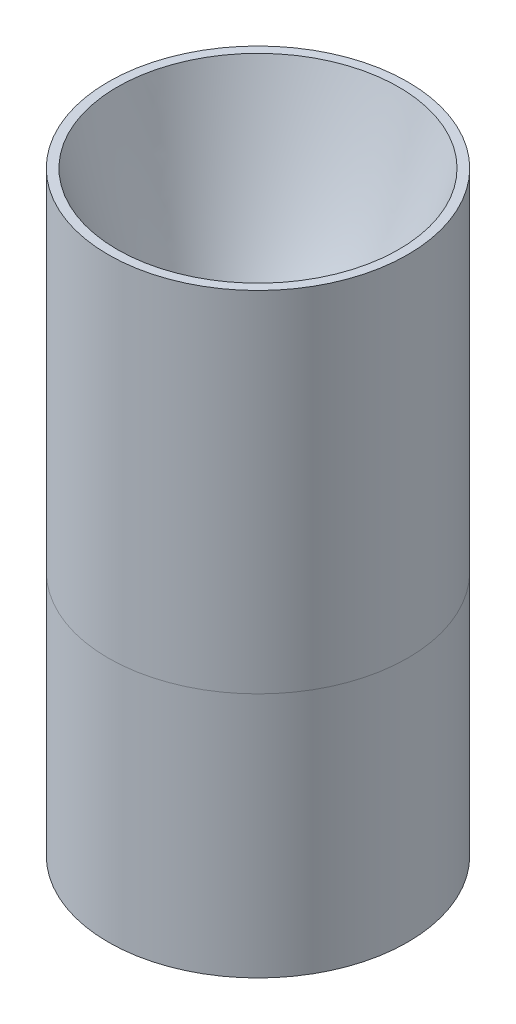
ISO-10303-21;
HEADER;
FILE_DESCRIPTION(('STEP AP214'),'2;1');
FILE_NAME('part.step','',(''),(''),'','','');
FILE_SCHEMA(('AUTOMOTIVE_DESIGN { 1 0 10303 214 1 1 1 1 }'));
ENDSEC;
DATA;
#1=APPLICATION_CONTEXT('core data for automotive mechanical design processes');
#2=APPLICATION_PROTOCOL_DEFINITION('international standard','automotive_design',2000,#1);
#3=PRODUCT_CONTEXT('',#1,'mechanical');
#4=PRODUCT('Part','Part','',(#3));
#5=PRODUCT_RELATED_PRODUCT_CATEGORY('part','',(#4));
#6=PRODUCT_DEFINITION_FORMATION('','',#4);
#7=PRODUCT_DEFINITION_CONTEXT('part definition',#1,'design');
#8=PRODUCT_DEFINITION('design','',#6,#7);
#9=PRODUCT_DEFINITION_SHAPE('','',#8);
#10=(LENGTH_UNIT() NAMED_UNIT(*) SI_UNIT(.MILLI.,.METRE.));
#11=(NAMED_UNIT(*) PLANE_ANGLE_UNIT() SI_UNIT($,.RADIAN.));
#12=(NAMED_UNIT(*) SI_UNIT($,.STERADIAN.) SOLID_ANGLE_UNIT());
#13=UNCERTAINTY_MEASURE_WITH_UNIT(LENGTH_MEASURE(1.E-05),#10,'distance_accuracy_value','');
#14=(GEOMETRIC_REPRESENTATION_CONTEXT(3) GLOBAL_UNCERTAINTY_ASSIGNED_CONTEXT((#13)) GLOBAL_UNIT_ASSIGNED_CONTEXT((#10,
#11,#12)) REPRESENTATION_CONTEXT('',''));
#15=CARTESIAN_POINT('',(0.,0.,0.));
#16=DIRECTION('',(0.,0.,1.));
#17=DIRECTION('',(1.,0.,0.));
#18=AXIS2_PLACEMENT_3D('',#15,#16,#17);
#19=CARTESIAN_POINT('',(-76.2,-67.8726529233654,-76.21));
#20=DIRECTION('',(0.,-1.,0.));
#21=DIRECTION('',(0.,0.,-1.));
#22=AXIS2_PLACEMENT_3D('',#19,#20,#21);
#23=PLANE('',#22);
#24=CARTESIAN_POINT('',(0.,-67.8726529233654,0.));
#25=DIRECTION('',(0.,-1.,0.));
#26=DIRECTION('',(0.,0.,-1.));
#27=AXIS2_PLACEMENT_3D('',#24,#25,#26);
#28=CIRCLE('',#27,53.7924602426016);
#29=CARTESIAN_POINT('',(0.,-67.8726529233654,-53.7924602426016));
#30=VERTEX_POINT('',#29);
#31=EDGE_CURVE('E100',#30,#30,#28,.F.);
#32=ORIENTED_EDGE('',*,*,#31,.T.);
#33=EDGE_LOOP('',(#32));
#34=FACE_BOUND('',#33,.T.);
#35=CARTESIAN_POINT('',(0.,-67.8726529233654,0.));
#36=DIRECTION('',(0.,-1.,0.));
#37=DIRECTION('',(0.,0.,-1.));
#38=AXIS2_PLACEMENT_3D('',#35,#36,#37);
#39=CIRCLE('',#38,76.2);
#40=CARTESIAN_POINT('',(0.,-67.8726529233654,-76.2));
#41=VERTEX_POINT('',#40);
#42=EDGE_CURVE('E48',#41,#41,#39,.T.);
#43=ORIENTED_EDGE('',*,*,#42,.T.);
#44=EDGE_LOOP('',(#43));
#45=FACE_BOUND('',#44,.T.);
#46=ADVANCED_FACE('F44',(#34,#45),#23,.T.);
#47=CARTESIAN_POINT('',(0.,0.,0.));
#48=DIRECTION('',(0.,1.,0.));
#49=DIRECTION('',(0.,0.,1.));
#50=AXIS2_PLACEMENT_3D('',#47,#48,#49);
#51=CYLINDRICAL_SURFACE('',#50,53.7924602426016);
#52=CARTESIAN_POINT('',(0.,-59.7276737058979,0.));
#53=DIRECTION('',(0.,1.,0.));
#54=DIRECTION('',(0.,0.,1.));
#55=AXIS2_PLACEMENT_3D('',#52,#53,#54);
#56=CIRCLE('',#55,53.7924602426016);
#57=CARTESIAN_POINT('',(0.,-59.7276737058979,53.7924602426016));
#58=VERTEX_POINT('',#57);
#59=EDGE_CURVE('E134',#58,#58,#56,.T.);
#60=ORIENTED_EDGE('',*,*,#59,.T.);
#61=EDGE_LOOP('',(#60));
#62=FACE_BOUND('',#61,.T.);
#63=ORIENTED_EDGE('',*,*,#31,.F.);
#64=EDGE_LOOP('',(#63));
#65=FACE_BOUND('',#64,.T.);
#66=ADVANCED_FACE('F46',(#62,#65),#51,.F.);
#67=CARTESIAN_POINT('',(0.,0.,0.));
#68=DIRECTION('',(0.,1.,0.));
#69=DIRECTION('',(0.,0.,1.));
#70=AXIS2_PLACEMENT_3D('',#67,#68,#69);
#71=CYLINDRICAL_SURFACE('',#70,76.2);
#72=CARTESIAN_POINT('',(0.,109.927347076635,0.));
#73=DIRECTION('',(0.,1.,0.));
#74=DIRECTION('',(0.,0.,1.));
#75=AXIS2_PLACEMENT_3D('',#72,#73,#74);
#76=CIRCLE('',#75,76.2);
#77=CARTESIAN_POINT('',(0.,109.927347076635,76.2));
#78=VERTEX_POINT('',#77);
#79=EDGE_CURVE('E57',#78,#78,#76,.T.);
#80=ORIENTED_EDGE('',*,*,#79,.F.);
#81=EDGE_LOOP('',(#80));
#82=FACE_BOUND('',#81,.T.);
#83=ORIENTED_EDGE('',*,*,#42,.F.);
#84=EDGE_LOOP('',(#83));
#85=FACE_BOUND('',#84,.T.);
#86=ADVANCED_FACE('F82',(#82,#85),#71,.T.);
#87=CARTESIAN_POINT('',(26.7062113287053,6.50923965033825,0.));
#88=CARTESIAN_POINT('',(26.6554523867853,6.45847884124841,0.));
#89=CARTESIAN_POINT('',(26.5813741961518,6.38212177902064,0.));
#90=CARTESIAN_POINT('',(26.4154873738352,6.20864164611654,0.));
#91=CARTESIAN_POINT('',(26.2772778817675,6.04995163656635,0.));
#92=CARTESIAN_POINT('',(26.089808500155,5.83291364729743,0.));
#93=CARTESIAN_POINT('',(25.9153376003489,5.61072754276574,0.));
#94=CARTESIAN_POINT('',(25.7027203959471,5.32551893593357,0.));
#95=CARTESIAN_POINT('',(25.5134468469557,5.04570386122365,0.));
#96=CARTESIAN_POINT('',(25.3274206305271,4.75130157548285,0.));
#97=CARTESIAN_POINT('',(25.1569443484507,4.45478312275658,0.));
#98=CARTESIAN_POINT('',(24.995002426509,4.14928218433454,0.));
#99=CARTESIAN_POINT('',(24.8462181027666,3.83966673272222,0.));
#100=CARTESIAN_POINT('',(24.7081288971286,3.52362715719563,0.));
#101=CARTESIAN_POINT('',(24.5825511965105,3.20334704099946,0.));
#102=CARTESIAN_POINT('',(24.4686735390696,2.87809264472723,0.));
#103=CARTESIAN_POINT('',(24.3672556972351,2.54923942069524,0.));
#104=CARTESIAN_POINT('',(24.2780737272776,2.21635441997579,0.));
#105=CARTESIAN_POINT('',(24.2014758273978,1.88099677694374,0.));
#106=CARTESIAN_POINT('',(24.1374314313173,1.54205049780854,0.));
#107=CARTESIAN_POINT('',(24.0861168447955,1.20253727286862,0.));
#108=CARTESIAN_POINT('',(24.0523672130417,0.901433327840423,0.));
#109=CARTESIAN_POINT('',(24.0314657247247,0.646764266269616,0.));
#110=CARTESIAN_POINT('',(24.0193936938296,0.427064117093707,0.));
#111=CARTESIAN_POINT('',(24.0129558487222,0.267641069384235,0.));
#112=CARTESIAN_POINT('',(24.0105384573959,0.11011368951911,0.));
#113=CARTESIAN_POINT('',(24.0100006264442,0.0358926521759333,0.));
#114=CARTESIAN_POINT('',(24.01,1.20494413205813E-13,0.));
#115=B_SPLINE_CURVE_WITH_KNOTS('',4,(#87,#88,#89,#90,#91,#92,#93,#94,#95,#96,#97,#98,#99,#100,
#101,#102,#103,#104,#105,#106,#107,#108,#109,#110,#111,#112,#113,#114),.UNSPECIFIED.,.F.,.F.,(5,
1,1,1,1,1,1,1,1,1,1,1,1,1,1,1,1,1,1,1,1,1,1,1,5),(0.0825688161645696,0.122284452541055,
0.142142270729318,0.162000088917581,0.201715725294151,0.241431361670644,0.281146998047181,
0.320862634423759,0.360578270800262,0.400293907176806,0.440009543553384,0.479725179929891,
0.519440816306429,0.55915645268299,0.598872089059496,0.638587725436031,0.678303361812587,
0.718018998189109,0.75773463456565,0.797450270942201,0.837165907318734,0.857023725507005,
0.876881543695275,0.896739361883545,0.916597180071815),.UNSPECIFIED.);
#116=CARTESIAN_POINT('',(0.,0.,0.));
#117=DIRECTION('',(0.,1.,0.));
#118=AXIS1_PLACEMENT('',#116,#117);
#119=SURFACE_OF_REVOLUTION('',#115,#118);
#120=CARTESIAN_POINT('',(0.,-4.72452789780989E-09,0.));
#121=DIRECTION('',(0.,1.,0.));
#122=DIRECTION('',(0.,0.,1.));
#123=AXIS2_PLACEMENT_3D('',#120,#121,#122);
#124=CIRCLE('',#123,24.0100000000001);
#125=CARTESIAN_POINT('',(0.,-4.72452789780989E-09,24.0100000000001));
#126=VERTEX_POINT('',#125);
#127=EDGE_CURVE('E102',#126,#126,#124,.T.);
#128=ORIENTED_EDGE('',*,*,#127,.F.);
#129=EDGE_LOOP('',(#128));
#130=FACE_BOUND('',#129,.T.);
#131=CARTESIAN_POINT('',(0.,6.50923965033824,0.));
#132=DIRECTION('',(0.,1.,0.));
#133=DIRECTION('',(0.,0.,1.));
#134=AXIS2_PLACEMENT_3D('',#131,#132,#133);
#135=CIRCLE('',#134,26.7062113287053);
#136=CARTESIAN_POINT('',(0.,6.50923965033824,26.7062113287053));
#137=VERTEX_POINT('',#136);
#138=EDGE_CURVE('E12',#137,#137,#135,.T.);
#139=ORIENTED_EDGE('',*,*,#138,.T.);
#140=EDGE_LOOP('',(#139));
#141=FACE_BOUND('',#140,.T.);
#142=ADVANCED_FACE('F84',(#130,#141),#119,.T.);
#143=CARTESIAN_POINT('',(24.0100000000001,-4.72452789780989E-09,0.));
#144=CARTESIAN_POINT('',(24.0100012309156,-0.0705286472666441,0.));
#145=CARTESIAN_POINT('',(24.0105303784992,-0.213584189894205,0.));
#146=CARTESIAN_POINT('',(24.0129060646509,-0.54318291608517,0.));
#147=CARTESIAN_POINT('',(24.0192304596572,-0.824160396804775,0.));
#148=CARTESIAN_POINT('',(24.0287155818229,-1.1948220716992,0.));
#149=CARTESIAN_POINT('',(24.0413578755689,-1.51343505827811,0.));
#150=CARTESIAN_POINT('',(24.0571581004895,-1.86193960317,0.));
#151=CARTESIAN_POINT('',(24.07611335996,-2.19370687168025,0.));
#152=CARTESIAN_POINT('',(24.1037509753362,-2.61806939978142,0.));
#153=CARTESIAN_POINT('',(24.143219183527,-3.12203394663846,0.));
#154=CARTESIAN_POINT('',(24.2142318460645,-3.87997867468465,0.));
#155=CARTESIAN_POINT('',(24.3340588203677,-4.88645038784397,0.));
#156=CARTESIAN_POINT('',(24.5104181901741,-6.05671075984786,0.));
#157=CARTESIAN_POINT('',(24.7618173837515,-7.38516641405154,0.));
#158=CARTESIAN_POINT('',(25.0627274686097,-8.70357451344124,0.));
#159=CARTESIAN_POINT('',(25.4127027830991,-10.0096372071723,0.));
#160=CARTESIAN_POINT('',(25.8112931475927,-11.3018195947936,0.));
#161=CARTESIAN_POINT('',(26.2578775602609,-12.578099332555,0.));
#162=CARTESIAN_POINT('',(26.7519354955161,-13.8368874810632,0.));
#163=CARTESIAN_POINT('',(27.2926052988802,-15.0761971252593,0.));
#164=CARTESIAN_POINT('',(27.8794115677625,-16.2946097895952,0.));
#165=CARTESIAN_POINT('',(28.5110715829117,-17.4899387890177,0.));
#166=CARTESIAN_POINT('',(29.187464585144,-18.6612877513699,0.));
#167=CARTESIAN_POINT('',(29.906377295056,-19.8057433900298,0.));
#168=CARTESIAN_POINT('',(30.6689541964365,-20.923860067459,0.));
#169=CARTESIAN_POINT('',(31.3700993928877,-21.8744117521936,0.));
#170=CARTESIAN_POINT('',(31.9996683259929,-22.6734454717036,0.));
#171=CARTESIAN_POINT('',(32.5350606215996,-23.32042212888,0.));
#172=CARTESIAN_POINT('',(32.9831879750428,-23.8400050066664,0.));
#173=CARTESIAN_POINT('',(33.419382234755,-24.329816235923,0.));
#174=CARTESIAN_POINT('',(33.8467583315013,-24.7884843790145,0.));
#175=CARTESIAN_POINT('',(34.1564908510342,-25.1138682991012,0.));
#176=CARTESIAN_POINT('',(34.4477921698421,-25.4096490354064,0.));
#177=CARTESIAN_POINT('',(34.5473446381365,-25.5099499205801,0.));
#178=CARTESIAN_POINT('',(34.5972150160149,-25.5598221055194,0.));
#179=B_SPLINE_CURVE_WITH_KNOTS('',4,(#143,#144,#145,#146,#147,#148,#149,#150,#151,#152,#153,
#154,#155,#156,#157,#158,#159,#160,#161,#162,#163,#164,#165,#166,#167,#168,#169,#170,#171,#172,
#173,#174,#175,#176,#177,#178),.UNSPECIFIED.,.F.,.F.,(5,1,1,1,1,1,1,1,1,1,1,1,1,1,1,1,1,1,1,1,1,
1,1,1,1,1,1,1,1,1,1,1,5),(0.0826377293508924,0.0925749264345495,0.10251212335078,
0.11244932026701,0.122386517183241,0.132323714099471,0.142260911015702,0.152198107931932,
0.162135304848163,0.182009698680624,0.201884092513085,0.241632880178006,0.281381667842927,
0.321130455507848,0.360879243172768,0.400628030837689,0.44037681850261,0.480125606167531,
0.519874393832452,0.559623181497373,0.599371969162294,0.639120756827214,0.678869544492136,
0.718618332157059,0.758367119821983,0.798115907486907,0.817990301319368,0.837864695151829,
0.857739088984291,0.877613482816753,0.897487876649217,0.907425073565449,0.917362270311961),.UNSPECIFIED.);
#180=CARTESIAN_POINT('',(0.,0.,0.));
#181=DIRECTION('',(0.,1.,0.));
#182=AXIS1_PLACEMENT('',#180,#181);
#183=SURFACE_OF_REVOLUTION('',#179,#182);
#184=CARTESIAN_POINT('',(0.,-25.5598221021881,0.));
#185=DIRECTION('',(0.,1.,0.));
#186=DIRECTION('',(0.,0.,1.));
#187=AXIS2_PLACEMENT_3D('',#184,#185,#186);
#188=CIRCLE('',#187,34.5972150126512);
#189=CARTESIAN_POINT('',(0.,-25.5598221021881,34.5972150126512));
#190=VERTEX_POINT('',#189);
#191=EDGE_CURVE('E105',#190,#190,#188,.T.);
#192=ORIENTED_EDGE('',*,*,#191,.F.);
#193=EDGE_LOOP('',(#192));
#194=FACE_BOUND('',#193,.T.);
#195=ORIENTED_EDGE('',*,*,#127,.T.);
#196=EDGE_LOOP('',(#195));
#197=FACE_BOUND('',#196,.T.);
#198=ADVANCED_FACE('F90',(#194,#197),#183,.T.);
#199=CARTESIAN_POINT('',(0.,-25.5598221021881,0.));
#200=DIRECTION('',(0.,-1.,0.));
#201=DIRECTION('',(0.,0.,-1.));
#202=AXIS2_PLACEMENT_3D('',#199,#200,#201);
#203=CONICAL_SURFACE('',#202,34.5972150126512,0.785398163436918);
#204=CARTESIAN_POINT('',(0.,-34.1674502896085,0.));
#205=DIRECTION('',(0.,1.,0.));
#206=DIRECTION('',(0.,0.,1.));
#207=AXIS2_PLACEMENT_3D('',#204,#205,#206);
#208=CIRCLE('',#207,43.2048432007511);
#209=CARTESIAN_POINT('',(0.,-34.1674502896085,43.2048432007511));
#210=VERTEX_POINT('',#209);
#211=EDGE_CURVE('E137',#210,#210,#208,.T.);
#212=ORIENTED_EDGE('',*,*,#211,.F.);
#213=EDGE_LOOP('',(#212));
#214=FACE_BOUND('',#213,.T.);
#215=ORIENTED_EDGE('',*,*,#191,.T.);
#216=EDGE_LOOP('',(#215));
#217=FACE_BOUND('',#216,.T.);
#218=ADVANCED_FACE('F120',(#214,#217),#203,.F.);
#219=CARTESIAN_POINT('',(43.2048432007511,-34.1674502896085,0.));
#220=CARTESIAN_POINT('',(43.254715360496,-34.2173226876373,0.));
#221=CARTESIAN_POINT('',(43.3553242834007,-34.3186769186513,0.));
#222=CARTESIAN_POINT('',(43.5850046206119,-34.5517100784772,0.));
#223=CARTESIAN_POINT('',(43.7848568413863,-34.7605007758853,0.));
#224=CARTESIAN_POINT('',(44.0923897247618,-35.0847918053969,0.));
#225=CARTESIAN_POINT('',(44.425708416898,-35.4471532725709,0.));
#226=CARTESIAN_POINT('',(44.8260591818365,-35.894408242166,0.));
#227=CARTESIAN_POINT('',(45.2637499216117,-36.4035418852592,0.));
#228=CARTESIAN_POINT('',(45.8044701878559,-37.0558327177902,0.));
#229=CARTESIAN_POINT('',(46.4308013225318,-37.8516123712284,0.));
#230=CARTESIAN_POINT('',(47.1340344140647,-38.8042368150057,0.));
#231=CARTESIAN_POINT('',(47.8954078119683,-39.9211332219499,0.));
#232=CARTESIAN_POINT('',(48.6150575378412,-41.0663154332557,0.));
#233=CARTESIAN_POINT('',(49.2910525566452,-42.2372537834184,0.));
#234=CARTESIAN_POINT('',(49.9229932712603,-43.4328620611364,0.));
#235=CARTESIAN_POINT('',(50.5096661138515,-44.6511293302762,0.));
#236=CARTESIAN_POINT('',(51.0504527402758,-45.8905689242083,0.));
#237=CARTESIAN_POINT('',(51.5444702286468,-47.1492955787166,0.));
#238=CARTESIAN_POINT('',(51.9352811531913,-48.2661297295693,0.));
#239=CARTESIAN_POINT('',(52.2402217683685,-49.2332382416906,0.));
#240=CARTESIAN_POINT('',(52.5209466666014,-50.2076495355927,0.));
#241=CARTESIAN_POINT('',(52.7773075768625,-51.1886995770477,0.));
#242=CARTESIAN_POINT('',(53.0029966579185,-52.1776033116881,0.));
#243=CARTESIAN_POINT('',(53.1977433077231,-53.1725857273114,0.));
#244=CARTESIAN_POINT('',(53.3676082864321,-54.1725959152755,0.));
#245=CARTESIAN_POINT('',(53.4883593736795,-55.0083263436567,0.));
#246=CARTESIAN_POINT('',(53.5882209762842,-55.8486408476214,0.));
#247=CARTESIAN_POINT('',(53.667125658231,-56.6881586458311,0.));
#248=CARTESIAN_POINT('',(53.7113378300975,-57.2811203791512,0.));
#249=CARTESIAN_POINT('',(53.7413501783569,-57.7817549222293,0.));
#250=CARTESIAN_POINT('',(53.7611010124291,-58.212998101023,0.));
#251=CARTESIAN_POINT('',(53.7737439146498,-58.532727966771,0.));
#252=CARTESIAN_POINT('',(53.7832294071524,-58.9049559716234,0.));
#253=CARTESIAN_POINT('',(53.7895540100479,-59.181725095308,0.));
#254=CARTESIAN_POINT('',(53.791929865194,-59.5155665817441,0.));
#255=CARTESIAN_POINT('',(53.7924590102253,-59.6571436353919,0.));
#256=CARTESIAN_POINT('',(53.7924602426013,-59.7276736885695,0.));
#257=B_SPLINE_CURVE_WITH_KNOTS('',4,(#219,#220,#221,#222,#223,#224,#225,#226,#227,#228,#229,
#230,#231,#232,#233,#234,#235,#236,#237,#238,#239,#240,#241,#242,#243,#244,#245,#246,#247,#248,
#249,#250,#251,#252,#253,#254,#255,#256),.UNSPECIFIED.,.F.,.F.,(5,1,1,1,1,1,1,1,1,1,1,1,1,1,1,1,
1,1,1,1,1,1,1,1,1,1,1,1,1,1,1,1,1,1,5),(0.0826377289041388,0.0925749252106824,0.102512122126915,
0.112449319043147,0.122386515959379,0.14226090979184,0.162135303624301,0.182009697456762,
0.201884091289222,0.241632878954144,0.281381666619066,0.321130454283987,0.360879241948909,
0.400628029613831,0.440376817278752,0.480125604943674,0.519874392608595,0.559623180273516,
0.599371967938437,0.619246361770898,0.639120755603359,0.678869543268281,0.718618330933202,
0.738492724765663,0.758367118598124,0.798115906263045,0.817990300095506,0.837864693927966,
0.857739087760428,0.867676284676658,0.877613481592889,0.887550678509119,0.897487875425349,
0.90742507234158,0.917362269871989),.UNSPECIFIED.);
#258=CARTESIAN_POINT('',(0.,0.,0.));
#259=DIRECTION('',(0.,1.,0.));
#260=AXIS1_PLACEMENT('',#258,#259);
#261=SURFACE_OF_REVOLUTION('',#257,#260);
#262=ORIENTED_EDGE('',*,*,#59,.F.);
#263=EDGE_LOOP('',(#262));
#264=FACE_BOUND('',#263,.T.);
#265=ORIENTED_EDGE('',*,*,#211,.T.);
#266=EDGE_LOOP('',(#265));
#267=FACE_BOUND('',#266,.T.);
#268=ADVANCED_FACE('F123',(#264,#267),#261,.T.);
#269=CARTESIAN_POINT('',(71.6384554787615,109.927347076635,0.));
#270=DIRECTION('',(0.,-1.,0.));
#271=DIRECTION('',(0.,0.,-1.));
#272=AXIS2_PLACEMENT_3D('',#269,#270,#271);
#273=PLANE('',#272);
#274=CARTESIAN_POINT('',(0.,109.927347076635,0.));
#275=DIRECTION('',(0.,1.,0.));
#276=DIRECTION('',(0.,0.,1.));
#277=AXIS2_PLACEMENT_3D('',#274,#275,#276);
#278=CIRCLE('',#277,71.6384554787615);
#279=CARTESIAN_POINT('',(0.,109.927347076635,71.6384554787615));
#280=VERTEX_POINT('',#279);
#281=EDGE_CURVE('E52',#280,#280,#278,.T.);
#282=ORIENTED_EDGE('',*,*,#281,.F.);
#283=EDGE_LOOP('',(#282));
#284=FACE_BOUND('',#283,.T.);
#285=ORIENTED_EDGE('',*,*,#79,.T.);
#286=EDGE_LOOP('',(#285));
#287=FACE_BOUND('',#286,.T.);
#288=ADVANCED_FACE('F77',(#284,#287),#273,.F.);
#289=CARTESIAN_POINT('',(71.6384554787615,109.927347076635,0.));
#290=CARTESIAN_POINT('',(49.1723334607279,34.6359542236987,0.));
#291=CARTESIAN_POINT('',(26.7062113287053,6.50923965033824,0.));
#292=B_SPLINE_CURVE_WITH_KNOTS('',2,(#289,#290,#291),.UNSPECIFIED.,.F.,.F.,(3,3),(0.,1.),.UNSPECIFIED.);
#293=CARTESIAN_POINT('',(0.,0.,0.));
#294=DIRECTION('',(0.,1.,0.));
#295=AXIS1_PLACEMENT('',#293,#294);
#296=SURFACE_OF_REVOLUTION('',#292,#295);
#297=ORIENTED_EDGE('',*,*,#138,.F.);
#298=EDGE_LOOP('',(#297));
#299=FACE_BOUND('',#298,.T.);
#300=ORIENTED_EDGE('',*,*,#281,.T.);
#301=EDGE_LOOP('',(#300));
#302=FACE_BOUND('',#301,.T.);
#303=ADVANCED_FACE('F73',(#299,#302),#296,.T.);
#304=CLOSED_SHELL('',(#46,#66,#86,#142,#198,#218,#268,#288,#303));
#305=MANIFOLD_SOLID_BREP('B2',#304);
#306=CARTESIAN_POINT('',(-76.2,-67.8726529233654,-76.21));
#307=DIRECTION('',(0.,-1.,0.));
#308=DIRECTION('',(0.,0.,-1.));
#309=AXIS2_PLACEMENT_3D('',#306,#307,#308);
#310=PLANE('',#309);
#311=CARTESIAN_POINT('',(0.,-67.8726529233654,0.));
#312=DIRECTION('',(0.,-1.,0.));
#313=DIRECTION('',(0.,0.,-1.));
#314=AXIS2_PLACEMENT_3D('',#311,#312,#313);
#315=CIRCLE('',#314,76.2);
#316=CARTESIAN_POINT('',(0.,-67.8726529233654,-76.2));
#317=VERTEX_POINT('',#316);
#318=EDGE_CURVE('E215',#317,#317,#315,.T.);
#319=ORIENTED_EDGE('',*,*,#318,.F.);
#320=EDGE_LOOP('',(#319));
#321=FACE_BOUND('',#320,.T.);
#322=CARTESIAN_POINT('',(0.,-67.8726529233654,0.));
#323=DIRECTION('',(0.,-1.,0.));
#324=DIRECTION('',(0.,0.,-1.));
#325=AXIS2_PLACEMENT_3D('',#322,#323,#324);
#326=CIRCLE('',#325,53.7924602426016);
#327=CARTESIAN_POINT('',(0.,-67.8726529233654,-53.7924602426016));
#328=VERTEX_POINT('',#327);
#329=EDGE_CURVE('E43',#328,#328,#326,.F.);
#330=ORIENTED_EDGE('',*,*,#329,.F.);
#331=EDGE_LOOP('',(#330));
#332=FACE_BOUND('',#331,.T.);
#333=ADVANCED_FACE('F209',(#321,#332),#310,.F.);
#334=CARTESIAN_POINT('',(76.2,-193.077673705898,0.));
#335=DIRECTION('',(0.,1.,0.));
#336=DIRECTION('',(0.,0.,1.));
#337=AXIS2_PLACEMENT_3D('',#334,#335,#336);
#338=PLANE('',#337);
#339=CARTESIAN_POINT('',(0.,-193.077673705898,0.));
#340=DIRECTION('',(0.,1.,0.));
#341=DIRECTION('',(0.,0.,1.));
#342=AXIS2_PLACEMENT_3D('',#339,#340,#341);
#343=CIRCLE('',#342,76.2);
#344=CARTESIAN_POINT('',(0.,-193.077673705898,76.2));
#345=VERTEX_POINT('',#344);
#346=EDGE_CURVE('E223',#345,#345,#343,.T.);
#347=ORIENTED_EDGE('',*,*,#346,.F.);
#348=EDGE_LOOP('',(#347));
#349=FACE_BOUND('',#348,.T.);
#350=CARTESIAN_POINT('',(0.,-193.077673705898,0.));
#351=DIRECTION('',(0.,1.,0.));
#352=DIRECTION('',(0.,0.,1.));
#353=AXIS2_PLACEMENT_3D('',#350,#351,#352);
#354=CIRCLE('',#353,53.7924602426016);
#355=CARTESIAN_POINT('',(0.,-193.077673705898,53.7924602426016));
#356=VERTEX_POINT('',#355);
#357=EDGE_CURVE('E219',#356,#356,#354,.T.);
#358=ORIENTED_EDGE('',*,*,#357,.T.);
#359=EDGE_LOOP('',(#358));
#360=FACE_BOUND('',#359,.T.);
#361=ADVANCED_FACE('F231',(#349,#360),#338,.F.);
#362=CARTESIAN_POINT('',(0.,0.,0.));
#363=DIRECTION('',(0.,1.,0.));
#364=DIRECTION('',(0.,0.,1.));
#365=AXIS2_PLACEMENT_3D('',#362,#363,#364);
#366=CYLINDRICAL_SURFACE('',#365,76.2);
#367=ORIENTED_EDGE('',*,*,#318,.T.);
#368=EDGE_LOOP('',(#367));
#369=FACE_BOUND('',#368,.T.);
#370=ORIENTED_EDGE('',*,*,#346,.T.);
#371=EDGE_LOOP('',(#370));
#372=FACE_BOUND('',#371,.T.);
#373=ADVANCED_FACE('F229',(#369,#372),#366,.T.);
#374=CARTESIAN_POINT('',(0.,0.,0.));
#375=DIRECTION('',(0.,1.,0.));
#376=DIRECTION('',(0.,0.,1.));
#377=AXIS2_PLACEMENT_3D('',#374,#375,#376);
#378=CYLINDRICAL_SURFACE('',#377,53.7924602426016);
#379=ORIENTED_EDGE('',*,*,#329,.T.);
#380=EDGE_LOOP('',(#379));
#381=FACE_BOUND('',#380,.T.);
#382=ORIENTED_EDGE('',*,*,#357,.F.);
#383=EDGE_LOOP('',(#382));
#384=FACE_BOUND('',#383,.T.);
#385=ADVANCED_FACE('F236',(#381,#384),#378,.F.);
#386=CLOSED_SHELL('',(#333,#361,#373,#385));
#387=MANIFOLD_SOLID_BREP('B7',#386);
#388=ADVANCED_BREP_SHAPE_REPRESENTATION('',(#18,#305,#387),#14);
#389=SHAPE_DEFINITION_REPRESENTATION(#9,#388);
ENDSEC;
END-ISO-10303-21;
